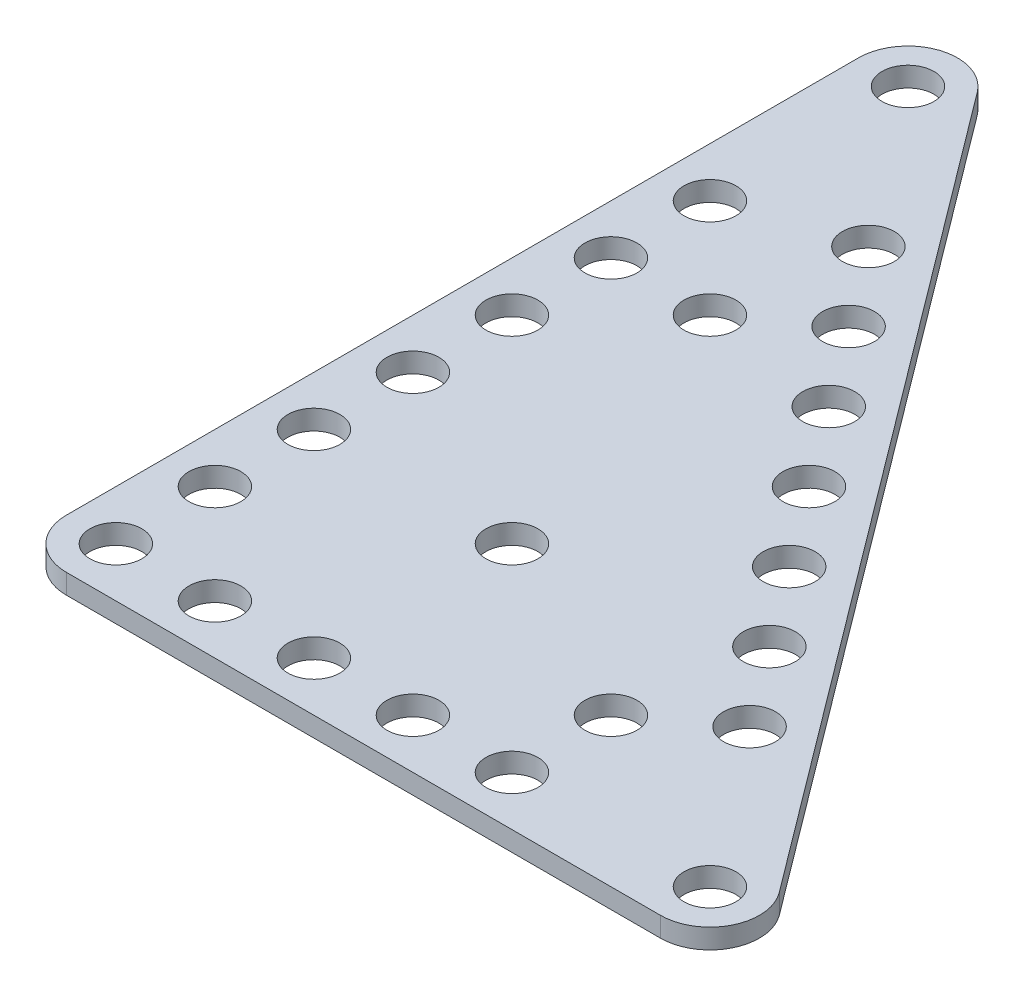
ISO-10303-21;
HEADER;
FILE_DESCRIPTION(('STEP AP214'),'2;1');
FILE_NAME('part.step','',(''),(''),'','','');
FILE_SCHEMA(('AUTOMOTIVE_DESIGN { 1 0 10303 214 1 1 1 1 }'));
ENDSEC;
DATA;
#1=APPLICATION_CONTEXT('core data for automotive mechanical design processes');
#2=APPLICATION_PROTOCOL_DEFINITION('international standard','automotive_design',2000,#1);
#3=PRODUCT_CONTEXT('',#1,'mechanical');
#4=PRODUCT('Part','Part','',(#3));
#5=PRODUCT_RELATED_PRODUCT_CATEGORY('part','',(#4));
#6=PRODUCT_DEFINITION_FORMATION('','',#4);
#7=PRODUCT_DEFINITION_CONTEXT('part definition',#1,'design');
#8=PRODUCT_DEFINITION('design','',#6,#7);
#9=PRODUCT_DEFINITION_SHAPE('','',#8);
#10=(LENGTH_UNIT() NAMED_UNIT(*) SI_UNIT(.MILLI.,.METRE.));
#11=(NAMED_UNIT(*) PLANE_ANGLE_UNIT() SI_UNIT($,.RADIAN.));
#12=(NAMED_UNIT(*) SI_UNIT($,.STERADIAN.) SOLID_ANGLE_UNIT());
#13=UNCERTAINTY_MEASURE_WITH_UNIT(LENGTH_MEASURE(1.E-05),#10,'distance_accuracy_value','');
#14=(GEOMETRIC_REPRESENTATION_CONTEXT(3) GLOBAL_UNCERTAINTY_ASSIGNED_CONTEXT((#13)) GLOBAL_UNIT_ASSIGNED_CONTEXT((#10,
#11,#12)) REPRESENTATION_CONTEXT('',''));
#15=CARTESIAN_POINT('',(0.,0.,0.));
#16=DIRECTION('',(0.,0.,1.));
#17=DIRECTION('',(1.,0.,0.));
#18=AXIS2_PLACEMENT_3D('',#15,#16,#17);
#19=CARTESIAN_POINT('',(0.,1.6,0.));
#20=DIRECTION('',(0.,1.,0.));
#21=DIRECTION('',(0.,0.,1.));
#22=AXIS2_PLACEMENT_3D('',#19,#20,#21);
#23=PLANE('',#22);
#24=DIRECTION('',(-0.6,0.,-0.8));
#25=VECTOR('',#24,1.);
#26=CARTESIAN_POINT('',(33.92,1.6,-25.44));
#27=LINE('',#26,#25);
#28=CARTESIAN_POINT('',(3.20000000000001,1.6,-66.4));
#29=VERTEX_POINT('',#28);
#30=CARTESIAN_POINT('',(51.2,1.6,-2.4));
#31=VERTEX_POINT('',#30);
#32=EDGE_CURVE('E100',#29,#31,#27,.F.);
#33=ORIENTED_EDGE('',*,*,#32,.F.);
#34=CARTESIAN_POINT('',(0.,1.6,-64.));
#35=DIRECTION('',(0.,-1.,0.));
#36=DIRECTION('',(0.,0.,-1.));
#37=AXIS2_PLACEMENT_3D('',#34,#35,#36);
#38=CIRCLE('',#37,4.);
#39=CARTESIAN_POINT('',(-4.,1.6,-64.));
#40=VERTEX_POINT('',#39);
#41=EDGE_CURVE('E179',#40,#29,#38,.T.);
#42=ORIENTED_EDGE('',*,*,#41,.F.);
#43=DIRECTION('',(0.,0.,1.));
#44=VECTOR('',#43,1.);
#45=CARTESIAN_POINT('',(-4.,1.6,0.));
#46=LINE('',#45,#44);
#47=CARTESIAN_POINT('',(-4.,1.6,0.));
#48=VERTEX_POINT('',#47);
#49=EDGE_CURVE('E75',#48,#40,#46,.F.);
#50=ORIENTED_EDGE('',*,*,#49,.F.);
#51=CARTESIAN_POINT('',(0.,1.6,0.));
#52=DIRECTION('',(0.,-1.,0.));
#53=DIRECTION('',(0.,0.,-1.));
#54=AXIS2_PLACEMENT_3D('',#51,#52,#53);
#55=CIRCLE('',#54,4.);
#56=CARTESIAN_POINT('',(0.,1.6,4.));
#57=VERTEX_POINT('',#56);
#58=EDGE_CURVE('E67',#57,#48,#55,.T.);
#59=ORIENTED_EDGE('',*,*,#58,.F.);
#60=DIRECTION('',(-1.,0.,0.));
#61=VECTOR('',#60,1.);
#62=CARTESIAN_POINT('',(0.,1.6,4.));
#63=LINE('',#62,#61);
#64=CARTESIAN_POINT('',(48.,1.6,4.));
#65=VERTEX_POINT('',#64);
#66=EDGE_CURVE('E72',#57,#65,#63,.F.);
#67=ORIENTED_EDGE('',*,*,#66,.T.);
#68=CARTESIAN_POINT('',(48.,1.6,0.));
#69=DIRECTION('',(0.,-1.,0.));
#70=DIRECTION('',(0.,0.,-1.));
#71=AXIS2_PLACEMENT_3D('',#68,#69,#70);
#72=CIRCLE('',#71,4.);
#73=EDGE_CURVE('E88',#31,#65,#72,.T.);
#74=ORIENTED_EDGE('',*,*,#73,.F.);
#75=EDGE_LOOP('',(#33,#42,#50,#59,#67,#74));
#76=FACE_BOUND('',#75,.T.);
#77=CARTESIAN_POINT('',(-1.6759110426447E-13,1.6,-48.));
#78=DIRECTION('',(0.,-1.,0.));
#79=DIRECTION('',(0.,0.,-1.));
#80=AXIS2_PLACEMENT_3D('',#77,#78,#79);
#81=CIRCLE('',#80,2.1);
#82=CARTESIAN_POINT('',(-1.6759110426447E-13,1.6,-50.1));
#83=VERTEX_POINT('',#82);
#84=EDGE_CURVE('E81',#83,#83,#81,.T.);
#85=ORIENTED_EDGE('',*,*,#84,.T.);
#86=EDGE_LOOP('',(#85));
#87=FACE_BOUND('',#86,.T.);
#88=CARTESIAN_POINT('',(-1.39659253553725E-13,1.6,-40.));
#89=DIRECTION('',(0.,-1.,0.));
#90=DIRECTION('',(0.,0.,-1.));
#91=AXIS2_PLACEMENT_3D('',#88,#89,#90);
#92=CIRCLE('',#91,2.1);
#93=CARTESIAN_POINT('',(-1.39659253553725E-13,1.6,-42.1));
#94=VERTEX_POINT('',#93);
#95=EDGE_CURVE('E185',#94,#94,#92,.T.);
#96=ORIENTED_EDGE('',*,*,#95,.T.);
#97=EDGE_LOOP('',(#96));
#98=FACE_BOUND('',#97,.T.);
#99=CARTESIAN_POINT('',(-1.1172740284298E-13,1.6,-32.));
#100=DIRECTION('',(0.,-1.,0.));
#101=DIRECTION('',(0.,0.,-1.));
#102=AXIS2_PLACEMENT_3D('',#99,#100,#101);
#103=CIRCLE('',#102,2.1);
#104=CARTESIAN_POINT('',(-1.1172740284298E-13,1.6,-34.1));
#105=VERTEX_POINT('',#104);
#106=EDGE_CURVE('E188',#105,#105,#103,.T.);
#107=ORIENTED_EDGE('',*,*,#106,.T.);
#108=EDGE_LOOP('',(#107));
#109=FACE_BOUND('',#108,.T.);
#110=CARTESIAN_POINT('',(0.,1.6,-24.));
#111=DIRECTION('',(0.,-1.,0.));
#112=DIRECTION('',(0.,0.,-1.));
#113=AXIS2_PLACEMENT_3D('',#110,#111,#112);
#114=CIRCLE('',#113,2.1);
#115=CARTESIAN_POINT('',(0.,1.6,-26.1));
#116=VERTEX_POINT('',#115);
#117=EDGE_CURVE('E191',#116,#116,#114,.T.);
#118=ORIENTED_EDGE('',*,*,#117,.T.);
#119=EDGE_LOOP('',(#118));
#120=FACE_BOUND('',#119,.T.);
#121=CARTESIAN_POINT('',(0.,1.6,-16.));
#122=DIRECTION('',(0.,-1.,0.));
#123=DIRECTION('',(0.,0.,-1.));
#124=AXIS2_PLACEMENT_3D('',#121,#122,#123);
#125=CIRCLE('',#124,2.1);
#126=CARTESIAN_POINT('',(0.,1.6,-18.1));
#127=VERTEX_POINT('',#126);
#128=EDGE_CURVE('E194',#127,#127,#125,.T.);
#129=ORIENTED_EDGE('',*,*,#128,.T.);
#130=EDGE_LOOP('',(#129));
#131=FACE_BOUND('',#130,.T.);
#132=CARTESIAN_POINT('',(0.,1.6,-8.));
#133=DIRECTION('',(0.,-1.,0.));
#134=DIRECTION('',(0.,0.,-1.));
#135=AXIS2_PLACEMENT_3D('',#132,#133,#134);
#136=CIRCLE('',#135,2.1);
#137=CARTESIAN_POINT('',(0.,1.6,-10.1));
#138=VERTEX_POINT('',#137);
#139=EDGE_CURVE('E197',#138,#138,#136,.T.);
#140=ORIENTED_EDGE('',*,*,#139,.T.);
#141=EDGE_LOOP('',(#140));
#142=FACE_BOUND('',#141,.T.);
#143=CARTESIAN_POINT('',(32.,1.6,0.));
#144=DIRECTION('',(0.,-1.,0.));
#145=DIRECTION('',(0.,0.,-1.));
#146=AXIS2_PLACEMENT_3D('',#143,#144,#145);
#147=CIRCLE('',#146,2.1);
#148=CARTESIAN_POINT('',(32.,1.6,-2.1));
#149=VERTEX_POINT('',#148);
#150=EDGE_CURVE('E200',#149,#149,#147,.T.);
#151=ORIENTED_EDGE('',*,*,#150,.T.);
#152=EDGE_LOOP('',(#151));
#153=FACE_BOUND('',#152,.T.);
#154=CARTESIAN_POINT('',(24.,1.6,0.));
#155=DIRECTION('',(0.,-1.,0.));
#156=DIRECTION('',(0.,0.,-1.));
#157=AXIS2_PLACEMENT_3D('',#154,#155,#156);
#158=CIRCLE('',#157,2.1);
#159=CARTESIAN_POINT('',(24.,1.6,-2.1));
#160=VERTEX_POINT('',#159);
#161=EDGE_CURVE('E203',#160,#160,#158,.T.);
#162=ORIENTED_EDGE('',*,*,#161,.T.);
#163=EDGE_LOOP('',(#162));
#164=FACE_BOUND('',#163,.T.);
#165=CARTESIAN_POINT('',(16.,1.6,0.));
#166=DIRECTION('',(0.,-1.,0.));
#167=DIRECTION('',(0.,0.,-1.));
#168=AXIS2_PLACEMENT_3D('',#165,#166,#167);
#169=CIRCLE('',#168,2.1);
#170=CARTESIAN_POINT('',(16.,1.6,-2.1));
#171=VERTEX_POINT('',#170);
#172=EDGE_CURVE('E206',#171,#171,#169,.T.);
#173=ORIENTED_EDGE('',*,*,#172,.T.);
#174=EDGE_LOOP('',(#173));
#175=FACE_BOUND('',#174,.T.);
#176=CARTESIAN_POINT('',(8.,1.6,0.));
#177=DIRECTION('',(0.,-1.,0.));
#178=DIRECTION('',(0.,0.,-1.));
#179=AXIS2_PLACEMENT_3D('',#176,#177,#178);
#180=CIRCLE('',#179,2.1);
#181=CARTESIAN_POINT('',(8.,1.6,-2.1));
#182=VERTEX_POINT('',#181);
#183=EDGE_CURVE('E209',#182,#182,#180,.T.);
#184=ORIENTED_EDGE('',*,*,#183,.T.);
#185=EDGE_LOOP('',(#184));
#186=FACE_BOUND('',#185,.T.);
#187=CARTESIAN_POINT('',(48.,1.6,0.));
#188=DIRECTION('',(0.,-1.,0.));
#189=DIRECTION('',(0.,0.,-1.));
#190=AXIS2_PLACEMENT_3D('',#187,#188,#189);
#191=CIRCLE('',#190,2.1);
#192=CARTESIAN_POINT('',(48.,1.6,-2.1));
#193=VERTEX_POINT('',#192);
#194=EDGE_CURVE('E212',#193,#193,#191,.T.);
#195=ORIENTED_EDGE('',*,*,#194,.T.);
#196=EDGE_LOOP('',(#195));
#197=FACE_BOUND('',#196,.T.);
#198=CARTESIAN_POINT('',(0.,1.6,0.));
#199=DIRECTION('',(0.,-1.,0.));
#200=DIRECTION('',(0.,0.,-1.));
#201=AXIS2_PLACEMENT_3D('',#198,#199,#200);
#202=CIRCLE('',#201,2.1);
#203=CARTESIAN_POINT('',(0.,1.6,-2.1));
#204=VERTEX_POINT('',#203);
#205=EDGE_CURVE('E215',#204,#204,#202,.T.);
#206=ORIENTED_EDGE('',*,*,#205,.T.);
#207=EDGE_LOOP('',(#206));
#208=FACE_BOUND('',#207,.T.);
#209=CARTESIAN_POINT('',(0.,1.6,-64.));
#210=DIRECTION('',(0.,-1.,0.));
#211=DIRECTION('',(0.,0.,-1.));
#212=AXIS2_PLACEMENT_3D('',#209,#210,#211);
#213=CIRCLE('',#212,2.1);
#214=CARTESIAN_POINT('',(0.,1.6,-66.1));
#215=VERTEX_POINT('',#214);
#216=EDGE_CURVE('E218',#215,#215,#213,.T.);
#217=ORIENTED_EDGE('',*,*,#216,.T.);
#218=EDGE_LOOP('',(#217));
#219=FACE_BOUND('',#218,.T.);
#220=CARTESIAN_POINT('',(16.,1.6,-16.));
#221=DIRECTION('',(0.,-1.,0.));
#222=DIRECTION('',(0.,0.,-1.));
#223=AXIS2_PLACEMENT_3D('',#220,#221,#222);
#224=CIRCLE('',#223,2.1);
#225=CARTESIAN_POINT('',(16.,1.6,-18.1));
#226=VERTEX_POINT('',#225);
#227=EDGE_CURVE('E221',#226,#226,#224,.T.);
#228=ORIENTED_EDGE('',*,*,#227,.T.);
#229=EDGE_LOOP('',(#228));
#230=FACE_BOUND('',#229,.T.);
#231=CARTESIAN_POINT('',(32.,1.6,-8.));
#232=DIRECTION('',(0.,-1.,0.));
#233=DIRECTION('',(0.,0.,-1.));
#234=AXIS2_PLACEMENT_3D('',#231,#232,#233);
#235=CIRCLE('',#234,2.1);
#236=CARTESIAN_POINT('',(32.,1.6,-10.1));
#237=VERTEX_POINT('',#236);
#238=EDGE_CURVE('E224',#237,#237,#235,.T.);
#239=ORIENTED_EDGE('',*,*,#238,.T.);
#240=EDGE_LOOP('',(#239));
#241=FACE_BOUND('',#240,.T.);
#242=CARTESIAN_POINT('',(8.,1.6,-40.));
#243=DIRECTION('',(0.,-1.,0.));
#244=DIRECTION('',(0.,0.,-1.));
#245=AXIS2_PLACEMENT_3D('',#242,#243,#244);
#246=CIRCLE('',#245,2.1);
#247=CARTESIAN_POINT('',(8.,1.6,-42.1));
#248=VERTEX_POINT('',#247);
#249=EDGE_CURVE('E227',#248,#248,#246,.T.);
#250=ORIENTED_EDGE('',*,*,#249,.T.);
#251=EDGE_LOOP('',(#250));
#252=FACE_BOUND('',#251,.T.);
#253=CARTESIAN_POINT('',(9.6,1.6,-51.2));
#254=DIRECTION('',(0.,-1.,0.));
#255=DIRECTION('',(0.,0.,-1.));
#256=AXIS2_PLACEMENT_3D('',#253,#254,#255);
#257=CIRCLE('',#256,2.1);
#258=CARTESIAN_POINT('',(9.6,1.6,-53.3));
#259=VERTEX_POINT('',#258);
#260=EDGE_CURVE('E230',#259,#259,#257,.T.);
#261=ORIENTED_EDGE('',*,*,#260,.T.);
#262=EDGE_LOOP('',(#261));
#263=FACE_BOUND('',#262,.T.);
#264=CARTESIAN_POINT('',(14.4,1.6,-44.8));
#265=DIRECTION('',(0.,-1.,0.));
#266=DIRECTION('',(0.,0.,-1.));
#267=AXIS2_PLACEMENT_3D('',#264,#265,#266);
#268=CIRCLE('',#267,2.1);
#269=CARTESIAN_POINT('',(14.4,1.6,-46.9));
#270=VERTEX_POINT('',#269);
#271=EDGE_CURVE('E233',#270,#270,#268,.T.);
#272=ORIENTED_EDGE('',*,*,#271,.T.);
#273=EDGE_LOOP('',(#272));
#274=FACE_BOUND('',#273,.T.);
#275=CARTESIAN_POINT('',(19.2,1.6,-38.4));
#276=DIRECTION('',(0.,-1.,0.));
#277=DIRECTION('',(0.,0.,-1.));
#278=AXIS2_PLACEMENT_3D('',#275,#276,#277);
#279=CIRCLE('',#278,2.1);
#280=CARTESIAN_POINT('',(19.2,1.6,-40.5));
#281=VERTEX_POINT('',#280);
#282=EDGE_CURVE('E236',#281,#281,#279,.T.);
#283=ORIENTED_EDGE('',*,*,#282,.T.);
#284=EDGE_LOOP('',(#283));
#285=FACE_BOUND('',#284,.T.);
#286=CARTESIAN_POINT('',(24.,1.6,-32.));
#287=DIRECTION('',(0.,-1.,0.));
#288=DIRECTION('',(0.,0.,-1.));
#289=AXIS2_PLACEMENT_3D('',#286,#287,#288);
#290=CIRCLE('',#289,2.1);
#291=CARTESIAN_POINT('',(24.,1.6,-34.1));
#292=VERTEX_POINT('',#291);
#293=EDGE_CURVE('E239',#292,#292,#290,.T.);
#294=ORIENTED_EDGE('',*,*,#293,.T.);
#295=EDGE_LOOP('',(#294));
#296=FACE_BOUND('',#295,.T.);
#297=CARTESIAN_POINT('',(28.8,1.6,-25.6));
#298=DIRECTION('',(0.,-1.,0.));
#299=DIRECTION('',(0.,0.,-1.));
#300=AXIS2_PLACEMENT_3D('',#297,#298,#299);
#301=CIRCLE('',#300,2.1);
#302=CARTESIAN_POINT('',(28.8,1.6,-27.7));
#303=VERTEX_POINT('',#302);
#304=EDGE_CURVE('E242',#303,#303,#301,.T.);
#305=ORIENTED_EDGE('',*,*,#304,.T.);
#306=EDGE_LOOP('',(#305));
#307=FACE_BOUND('',#306,.T.);
#308=CARTESIAN_POINT('',(33.6,1.6,-19.2));
#309=DIRECTION('',(0.,-1.,0.));
#310=DIRECTION('',(0.,0.,-1.));
#311=AXIS2_PLACEMENT_3D('',#308,#309,#310);
#312=CIRCLE('',#311,2.1);
#313=CARTESIAN_POINT('',(33.6,1.6,-21.3));
#314=VERTEX_POINT('',#313);
#315=EDGE_CURVE('E244',#314,#314,#312,.T.);
#316=ORIENTED_EDGE('',*,*,#315,.T.);
#317=EDGE_LOOP('',(#316));
#318=FACE_BOUND('',#317,.T.);
#319=CARTESIAN_POINT('',(38.4,1.6,-12.8));
#320=DIRECTION('',(0.,-1.,0.));
#321=DIRECTION('',(0.,0.,-1.));
#322=AXIS2_PLACEMENT_3D('',#319,#320,#321);
#323=CIRCLE('',#322,2.1);
#324=CARTESIAN_POINT('',(38.4,1.6,-14.9));
#325=VERTEX_POINT('',#324);
#326=EDGE_CURVE('E20',#325,#325,#323,.T.);
#327=ORIENTED_EDGE('',*,*,#326,.T.);
#328=EDGE_LOOP('',(#327));
#329=FACE_BOUND('',#328,.T.);
#330=ADVANCED_FACE('F17',(#76,#87,#98,#109,#120,#131,#142,#153,#164,#175,#186,#197,#208,#219,
#230,#241,#252,#263,#274,#285,#296,#307,#318,#329),#23,.T.);
#331=CARTESIAN_POINT('',(38.4,1.6,-12.8));
#332=DIRECTION('',(0.,-1.,0.));
#333=DIRECTION('',(0.,0.,-1.));
#334=AXIS2_PLACEMENT_3D('',#331,#332,#333);
#335=CYLINDRICAL_SURFACE('',#334,2.1);
#336=CARTESIAN_POINT('',(38.4,0.,-12.8));
#337=DIRECTION('',(0.,-1.,0.));
#338=DIRECTION('',(0.,0.,-1.));
#339=AXIS2_PLACEMENT_3D('',#336,#337,#338);
#340=CIRCLE('',#339,2.1);
#341=CARTESIAN_POINT('',(38.4,0.,-14.9));
#342=VERTEX_POINT('',#341);
#343=EDGE_CURVE('E176',#342,#342,#340,.T.);
#344=ORIENTED_EDGE('',*,*,#343,.T.);
#345=EDGE_LOOP('',(#344));
#346=FACE_BOUND('',#345,.T.);
#347=ORIENTED_EDGE('',*,*,#326,.F.);
#348=EDGE_LOOP('',(#347));
#349=FACE_BOUND('',#348,.T.);
#350=ADVANCED_FACE('F252',(#346,#349),#335,.F.);
#351=CARTESIAN_POINT('',(33.6,1.6,-19.2));
#352=DIRECTION('',(0.,-1.,0.));
#353=DIRECTION('',(0.,0.,-1.));
#354=AXIS2_PLACEMENT_3D('',#351,#352,#353);
#355=CYLINDRICAL_SURFACE('',#354,2.1);
#356=CARTESIAN_POINT('',(33.6,0.,-19.2));
#357=DIRECTION('',(0.,-1.,0.));
#358=DIRECTION('',(0.,0.,-1.));
#359=AXIS2_PLACEMENT_3D('',#356,#357,#358);
#360=CIRCLE('',#359,2.1);
#361=CARTESIAN_POINT('',(33.6,0.,-21.3));
#362=VERTEX_POINT('',#361);
#363=EDGE_CURVE('E173',#362,#362,#360,.T.);
#364=ORIENTED_EDGE('',*,*,#363,.T.);
#365=EDGE_LOOP('',(#364));
#366=FACE_BOUND('',#365,.T.);
#367=ORIENTED_EDGE('',*,*,#315,.F.);
#368=EDGE_LOOP('',(#367));
#369=FACE_BOUND('',#368,.T.);
#370=ADVANCED_FACE('F254',(#366,#369),#355,.F.);
#371=CARTESIAN_POINT('',(28.8,1.6,-25.6));
#372=DIRECTION('',(0.,-1.,0.));
#373=DIRECTION('',(0.,0.,-1.));
#374=AXIS2_PLACEMENT_3D('',#371,#372,#373);
#375=CYLINDRICAL_SURFACE('',#374,2.1);
#376=CARTESIAN_POINT('',(28.8,0.,-25.6));
#377=DIRECTION('',(0.,-1.,0.));
#378=DIRECTION('',(0.,0.,-1.));
#379=AXIS2_PLACEMENT_3D('',#376,#377,#378);
#380=CIRCLE('',#379,2.1);
#381=CARTESIAN_POINT('',(28.8,0.,-27.7));
#382=VERTEX_POINT('',#381);
#383=EDGE_CURVE('E170',#382,#382,#380,.T.);
#384=ORIENTED_EDGE('',*,*,#383,.T.);
#385=EDGE_LOOP('',(#384));
#386=FACE_BOUND('',#385,.T.);
#387=ORIENTED_EDGE('',*,*,#304,.F.);
#388=EDGE_LOOP('',(#387));
#389=FACE_BOUND('',#388,.T.);
#390=ADVANCED_FACE('F261',(#386,#389),#375,.F.);
#391=CARTESIAN_POINT('',(24.,1.6,-32.));
#392=DIRECTION('',(0.,-1.,0.));
#393=DIRECTION('',(0.,0.,-1.));
#394=AXIS2_PLACEMENT_3D('',#391,#392,#393);
#395=CYLINDRICAL_SURFACE('',#394,2.1);
#396=CARTESIAN_POINT('',(24.,0.,-32.));
#397=DIRECTION('',(0.,-1.,0.));
#398=DIRECTION('',(0.,0.,-1.));
#399=AXIS2_PLACEMENT_3D('',#396,#397,#398);
#400=CIRCLE('',#399,2.1);
#401=CARTESIAN_POINT('',(24.,0.,-34.1));
#402=VERTEX_POINT('',#401);
#403=EDGE_CURVE('E167',#402,#402,#400,.T.);
#404=ORIENTED_EDGE('',*,*,#403,.T.);
#405=EDGE_LOOP('',(#404));
#406=FACE_BOUND('',#405,.T.);
#407=ORIENTED_EDGE('',*,*,#293,.F.);
#408=EDGE_LOOP('',(#407));
#409=FACE_BOUND('',#408,.T.);
#410=ADVANCED_FACE('F367',(#406,#409),#395,.F.);
#411=CARTESIAN_POINT('',(19.2,1.6,-38.4));
#412=DIRECTION('',(0.,-1.,0.));
#413=DIRECTION('',(0.,0.,-1.));
#414=AXIS2_PLACEMENT_3D('',#411,#412,#413);
#415=CYLINDRICAL_SURFACE('',#414,2.1);
#416=CARTESIAN_POINT('',(19.2,0.,-38.4));
#417=DIRECTION('',(0.,-1.,0.));
#418=DIRECTION('',(0.,0.,-1.));
#419=AXIS2_PLACEMENT_3D('',#416,#417,#418);
#420=CIRCLE('',#419,2.1);
#421=CARTESIAN_POINT('',(19.2,0.,-40.5));
#422=VERTEX_POINT('',#421);
#423=EDGE_CURVE('E164',#422,#422,#420,.T.);
#424=ORIENTED_EDGE('',*,*,#423,.T.);
#425=EDGE_LOOP('',(#424));
#426=FACE_BOUND('',#425,.T.);
#427=ORIENTED_EDGE('',*,*,#282,.F.);
#428=EDGE_LOOP('',(#427));
#429=FACE_BOUND('',#428,.T.);
#430=ADVANCED_FACE('F363',(#426,#429),#415,.F.);
#431=CARTESIAN_POINT('',(14.4,1.6,-44.8));
#432=DIRECTION('',(0.,-1.,0.));
#433=DIRECTION('',(0.,0.,-1.));
#434=AXIS2_PLACEMENT_3D('',#431,#432,#433);
#435=CYLINDRICAL_SURFACE('',#434,2.1);
#436=CARTESIAN_POINT('',(14.4,0.,-44.8));
#437=DIRECTION('',(0.,-1.,0.));
#438=DIRECTION('',(0.,0.,-1.));
#439=AXIS2_PLACEMENT_3D('',#436,#437,#438);
#440=CIRCLE('',#439,2.1);
#441=CARTESIAN_POINT('',(14.4,0.,-46.9));
#442=VERTEX_POINT('',#441);
#443=EDGE_CURVE('E161',#442,#442,#440,.T.);
#444=ORIENTED_EDGE('',*,*,#443,.T.);
#445=EDGE_LOOP('',(#444));
#446=FACE_BOUND('',#445,.T.);
#447=ORIENTED_EDGE('',*,*,#271,.F.);
#448=EDGE_LOOP('',(#447));
#449=FACE_BOUND('',#448,.T.);
#450=ADVANCED_FACE('F359',(#446,#449),#435,.F.);
#451=CARTESIAN_POINT('',(9.6,1.6,-51.2));
#452=DIRECTION('',(0.,-1.,0.));
#453=DIRECTION('',(0.,0.,-1.));
#454=AXIS2_PLACEMENT_3D('',#451,#452,#453);
#455=CYLINDRICAL_SURFACE('',#454,2.1);
#456=CARTESIAN_POINT('',(9.6,0.,-51.2));
#457=DIRECTION('',(0.,-1.,0.));
#458=DIRECTION('',(0.,0.,-1.));
#459=AXIS2_PLACEMENT_3D('',#456,#457,#458);
#460=CIRCLE('',#459,2.1);
#461=CARTESIAN_POINT('',(9.6,0.,-53.3));
#462=VERTEX_POINT('',#461);
#463=EDGE_CURVE('E158',#462,#462,#460,.T.);
#464=ORIENTED_EDGE('',*,*,#463,.T.);
#465=EDGE_LOOP('',(#464));
#466=FACE_BOUND('',#465,.T.);
#467=ORIENTED_EDGE('',*,*,#260,.F.);
#468=EDGE_LOOP('',(#467));
#469=FACE_BOUND('',#468,.T.);
#470=ADVANCED_FACE('F355',(#466,#469),#455,.F.);
#471=CARTESIAN_POINT('',(8.,1.6,-40.));
#472=DIRECTION('',(0.,-1.,0.));
#473=DIRECTION('',(0.,0.,-1.));
#474=AXIS2_PLACEMENT_3D('',#471,#472,#473);
#475=CYLINDRICAL_SURFACE('',#474,2.1);
#476=CARTESIAN_POINT('',(8.,0.,-40.));
#477=DIRECTION('',(0.,-1.,0.));
#478=DIRECTION('',(0.,0.,-1.));
#479=AXIS2_PLACEMENT_3D('',#476,#477,#478);
#480=CIRCLE('',#479,2.1);
#481=CARTESIAN_POINT('',(8.,0.,-42.1));
#482=VERTEX_POINT('',#481);
#483=EDGE_CURVE('E155',#482,#482,#480,.T.);
#484=ORIENTED_EDGE('',*,*,#483,.T.);
#485=EDGE_LOOP('',(#484));
#486=FACE_BOUND('',#485,.T.);
#487=ORIENTED_EDGE('',*,*,#249,.F.);
#488=EDGE_LOOP('',(#487));
#489=FACE_BOUND('',#488,.T.);
#490=ADVANCED_FACE('F351',(#486,#489),#475,.F.);
#491=CARTESIAN_POINT('',(32.,1.6,-8.));
#492=DIRECTION('',(0.,-1.,0.));
#493=DIRECTION('',(0.,0.,-1.));
#494=AXIS2_PLACEMENT_3D('',#491,#492,#493);
#495=CYLINDRICAL_SURFACE('',#494,2.1);
#496=CARTESIAN_POINT('',(32.,0.,-8.));
#497=DIRECTION('',(0.,-1.,0.));
#498=DIRECTION('',(0.,0.,-1.));
#499=AXIS2_PLACEMENT_3D('',#496,#497,#498);
#500=CIRCLE('',#499,2.1);
#501=CARTESIAN_POINT('',(32.,0.,-10.1));
#502=VERTEX_POINT('',#501);
#503=EDGE_CURVE('E152',#502,#502,#500,.T.);
#504=ORIENTED_EDGE('',*,*,#503,.T.);
#505=EDGE_LOOP('',(#504));
#506=FACE_BOUND('',#505,.T.);
#507=ORIENTED_EDGE('',*,*,#238,.F.);
#508=EDGE_LOOP('',(#507));
#509=FACE_BOUND('',#508,.T.);
#510=ADVANCED_FACE('F347',(#506,#509),#495,.F.);
#511=CARTESIAN_POINT('',(16.,1.6,-16.));
#512=DIRECTION('',(0.,-1.,0.));
#513=DIRECTION('',(0.,0.,-1.));
#514=AXIS2_PLACEMENT_3D('',#511,#512,#513);
#515=CYLINDRICAL_SURFACE('',#514,2.1);
#516=CARTESIAN_POINT('',(16.,0.,-16.));
#517=DIRECTION('',(0.,-1.,0.));
#518=DIRECTION('',(0.,0.,-1.));
#519=AXIS2_PLACEMENT_3D('',#516,#517,#518);
#520=CIRCLE('',#519,2.1);
#521=CARTESIAN_POINT('',(16.,0.,-18.1));
#522=VERTEX_POINT('',#521);
#523=EDGE_CURVE('E149',#522,#522,#520,.T.);
#524=ORIENTED_EDGE('',*,*,#523,.T.);
#525=EDGE_LOOP('',(#524));
#526=FACE_BOUND('',#525,.T.);
#527=ORIENTED_EDGE('',*,*,#227,.F.);
#528=EDGE_LOOP('',(#527));
#529=FACE_BOUND('',#528,.T.);
#530=ADVANCED_FACE('F343',(#526,#529),#515,.F.);
#531=CARTESIAN_POINT('',(0.,1.6,-64.));
#532=DIRECTION('',(0.,-1.,0.));
#533=DIRECTION('',(0.,0.,-1.));
#534=AXIS2_PLACEMENT_3D('',#531,#532,#533);
#535=CYLINDRICAL_SURFACE('',#534,2.1);
#536=CARTESIAN_POINT('',(0.,0.,-64.));
#537=DIRECTION('',(0.,-1.,0.));
#538=DIRECTION('',(0.,0.,-1.));
#539=AXIS2_PLACEMENT_3D('',#536,#537,#538);
#540=CIRCLE('',#539,2.1);
#541=CARTESIAN_POINT('',(0.,0.,-66.1));
#542=VERTEX_POINT('',#541);
#543=EDGE_CURVE('E146',#542,#542,#540,.T.);
#544=ORIENTED_EDGE('',*,*,#543,.T.);
#545=EDGE_LOOP('',(#544));
#546=FACE_BOUND('',#545,.T.);
#547=ORIENTED_EDGE('',*,*,#216,.F.);
#548=EDGE_LOOP('',(#547));
#549=FACE_BOUND('',#548,.T.);
#550=ADVANCED_FACE('F339',(#546,#549),#535,.F.);
#551=CARTESIAN_POINT('',(0.,1.6,0.));
#552=DIRECTION('',(0.,-1.,0.));
#553=DIRECTION('',(0.,0.,-1.));
#554=AXIS2_PLACEMENT_3D('',#551,#552,#553);
#555=CYLINDRICAL_SURFACE('',#554,2.1);
#556=CARTESIAN_POINT('',(0.,0.,0.));
#557=DIRECTION('',(0.,-1.,0.));
#558=DIRECTION('',(0.,0.,-1.));
#559=AXIS2_PLACEMENT_3D('',#556,#557,#558);
#560=CIRCLE('',#559,2.1);
#561=CARTESIAN_POINT('',(0.,0.,-2.1));
#562=VERTEX_POINT('',#561);
#563=EDGE_CURVE('E143',#562,#562,#560,.T.);
#564=ORIENTED_EDGE('',*,*,#563,.T.);
#565=EDGE_LOOP('',(#564));
#566=FACE_BOUND('',#565,.T.);
#567=ORIENTED_EDGE('',*,*,#205,.F.);
#568=EDGE_LOOP('',(#567));
#569=FACE_BOUND('',#568,.T.);
#570=ADVANCED_FACE('F335',(#566,#569),#555,.F.);
#571=CARTESIAN_POINT('',(48.,1.6,0.));
#572=DIRECTION('',(0.,-1.,0.));
#573=DIRECTION('',(0.,0.,-1.));
#574=AXIS2_PLACEMENT_3D('',#571,#572,#573);
#575=CYLINDRICAL_SURFACE('',#574,2.1);
#576=CARTESIAN_POINT('',(48.,0.,0.));
#577=DIRECTION('',(0.,-1.,0.));
#578=DIRECTION('',(0.,0.,-1.));
#579=AXIS2_PLACEMENT_3D('',#576,#577,#578);
#580=CIRCLE('',#579,2.1);
#581=CARTESIAN_POINT('',(48.,0.,-2.1));
#582=VERTEX_POINT('',#581);
#583=EDGE_CURVE('E140',#582,#582,#580,.T.);
#584=ORIENTED_EDGE('',*,*,#583,.T.);
#585=EDGE_LOOP('',(#584));
#586=FACE_BOUND('',#585,.T.);
#587=ORIENTED_EDGE('',*,*,#194,.F.);
#588=EDGE_LOOP('',(#587));
#589=FACE_BOUND('',#588,.T.);
#590=ADVANCED_FACE('F331',(#586,#589),#575,.F.);
#591=CARTESIAN_POINT('',(8.,1.6,0.));
#592=DIRECTION('',(0.,-1.,0.));
#593=DIRECTION('',(0.,0.,-1.));
#594=AXIS2_PLACEMENT_3D('',#591,#592,#593);
#595=CYLINDRICAL_SURFACE('',#594,2.1);
#596=CARTESIAN_POINT('',(8.,0.,0.));
#597=DIRECTION('',(0.,-1.,0.));
#598=DIRECTION('',(0.,0.,-1.));
#599=AXIS2_PLACEMENT_3D('',#596,#597,#598);
#600=CIRCLE('',#599,2.1);
#601=CARTESIAN_POINT('',(8.,0.,-2.1));
#602=VERTEX_POINT('',#601);
#603=EDGE_CURVE('E137',#602,#602,#600,.T.);
#604=ORIENTED_EDGE('',*,*,#603,.T.);
#605=EDGE_LOOP('',(#604));
#606=FACE_BOUND('',#605,.T.);
#607=ORIENTED_EDGE('',*,*,#183,.F.);
#608=EDGE_LOOP('',(#607));
#609=FACE_BOUND('',#608,.T.);
#610=ADVANCED_FACE('F327',(#606,#609),#595,.F.);
#611=CARTESIAN_POINT('',(16.,1.6,0.));
#612=DIRECTION('',(0.,-1.,0.));
#613=DIRECTION('',(0.,0.,-1.));
#614=AXIS2_PLACEMENT_3D('',#611,#612,#613);
#615=CYLINDRICAL_SURFACE('',#614,2.1);
#616=CARTESIAN_POINT('',(16.,0.,0.));
#617=DIRECTION('',(0.,-1.,0.));
#618=DIRECTION('',(0.,0.,-1.));
#619=AXIS2_PLACEMENT_3D('',#616,#617,#618);
#620=CIRCLE('',#619,2.1);
#621=CARTESIAN_POINT('',(16.,0.,-2.1));
#622=VERTEX_POINT('',#621);
#623=EDGE_CURVE('E134',#622,#622,#620,.T.);
#624=ORIENTED_EDGE('',*,*,#623,.T.);
#625=EDGE_LOOP('',(#624));
#626=FACE_BOUND('',#625,.T.);
#627=ORIENTED_EDGE('',*,*,#172,.F.);
#628=EDGE_LOOP('',(#627));
#629=FACE_BOUND('',#628,.T.);
#630=ADVANCED_FACE('F323',(#626,#629),#615,.F.);
#631=CARTESIAN_POINT('',(24.,1.6,0.));
#632=DIRECTION('',(0.,-1.,0.));
#633=DIRECTION('',(0.,0.,-1.));
#634=AXIS2_PLACEMENT_3D('',#631,#632,#633);
#635=CYLINDRICAL_SURFACE('',#634,2.1);
#636=CARTESIAN_POINT('',(24.,0.,0.));
#637=DIRECTION('',(0.,-1.,0.));
#638=DIRECTION('',(0.,0.,-1.));
#639=AXIS2_PLACEMENT_3D('',#636,#637,#638);
#640=CIRCLE('',#639,2.1);
#641=CARTESIAN_POINT('',(24.,0.,-2.1));
#642=VERTEX_POINT('',#641);
#643=EDGE_CURVE('E131',#642,#642,#640,.T.);
#644=ORIENTED_EDGE('',*,*,#643,.T.);
#645=EDGE_LOOP('',(#644));
#646=FACE_BOUND('',#645,.T.);
#647=ORIENTED_EDGE('',*,*,#161,.F.);
#648=EDGE_LOOP('',(#647));
#649=FACE_BOUND('',#648,.T.);
#650=ADVANCED_FACE('F319',(#646,#649),#635,.F.);
#651=CARTESIAN_POINT('',(32.,1.6,0.));
#652=DIRECTION('',(0.,-1.,0.));
#653=DIRECTION('',(0.,0.,-1.));
#654=AXIS2_PLACEMENT_3D('',#651,#652,#653);
#655=CYLINDRICAL_SURFACE('',#654,2.1);
#656=CARTESIAN_POINT('',(32.,0.,0.));
#657=DIRECTION('',(0.,-1.,0.));
#658=DIRECTION('',(0.,0.,-1.));
#659=AXIS2_PLACEMENT_3D('',#656,#657,#658);
#660=CIRCLE('',#659,2.1);
#661=CARTESIAN_POINT('',(32.,0.,-2.1));
#662=VERTEX_POINT('',#661);
#663=EDGE_CURVE('E128',#662,#662,#660,.T.);
#664=ORIENTED_EDGE('',*,*,#663,.T.);
#665=EDGE_LOOP('',(#664));
#666=FACE_BOUND('',#665,.T.);
#667=ORIENTED_EDGE('',*,*,#150,.F.);
#668=EDGE_LOOP('',(#667));
#669=FACE_BOUND('',#668,.T.);
#670=ADVANCED_FACE('F315',(#666,#669),#655,.F.);
#671=CARTESIAN_POINT('',(0.,1.6,-8.));
#672=DIRECTION('',(0.,-1.,0.));
#673=DIRECTION('',(0.,0.,-1.));
#674=AXIS2_PLACEMENT_3D('',#671,#672,#673);
#675=CYLINDRICAL_SURFACE('',#674,2.1);
#676=CARTESIAN_POINT('',(0.,0.,-8.));
#677=DIRECTION('',(0.,-1.,0.));
#678=DIRECTION('',(0.,0.,-1.));
#679=AXIS2_PLACEMENT_3D('',#676,#677,#678);
#680=CIRCLE('',#679,2.1);
#681=CARTESIAN_POINT('',(0.,0.,-10.1));
#682=VERTEX_POINT('',#681);
#683=EDGE_CURVE('E125',#682,#682,#680,.T.);
#684=ORIENTED_EDGE('',*,*,#683,.T.);
#685=EDGE_LOOP('',(#684));
#686=FACE_BOUND('',#685,.T.);
#687=ORIENTED_EDGE('',*,*,#139,.F.);
#688=EDGE_LOOP('',(#687));
#689=FACE_BOUND('',#688,.T.);
#690=ADVANCED_FACE('F311',(#686,#689),#675,.F.);
#691=CARTESIAN_POINT('',(0.,1.6,-16.));
#692=DIRECTION('',(0.,-1.,0.));
#693=DIRECTION('',(0.,0.,-1.));
#694=AXIS2_PLACEMENT_3D('',#691,#692,#693);
#695=CYLINDRICAL_SURFACE('',#694,2.1);
#696=CARTESIAN_POINT('',(0.,0.,-16.));
#697=DIRECTION('',(0.,-1.,0.));
#698=DIRECTION('',(0.,0.,-1.));
#699=AXIS2_PLACEMENT_3D('',#696,#697,#698);
#700=CIRCLE('',#699,2.1);
#701=CARTESIAN_POINT('',(0.,0.,-18.1));
#702=VERTEX_POINT('',#701);
#703=EDGE_CURVE('E122',#702,#702,#700,.T.);
#704=ORIENTED_EDGE('',*,*,#703,.T.);
#705=EDGE_LOOP('',(#704));
#706=FACE_BOUND('',#705,.T.);
#707=ORIENTED_EDGE('',*,*,#128,.F.);
#708=EDGE_LOOP('',(#707));
#709=FACE_BOUND('',#708,.T.);
#710=ADVANCED_FACE('F307',(#706,#709),#695,.F.);
#711=CARTESIAN_POINT('',(0.,1.6,-24.));
#712=DIRECTION('',(0.,-1.,0.));
#713=DIRECTION('',(0.,0.,-1.));
#714=AXIS2_PLACEMENT_3D('',#711,#712,#713);
#715=CYLINDRICAL_SURFACE('',#714,2.1);
#716=CARTESIAN_POINT('',(0.,0.,-24.));
#717=DIRECTION('',(0.,-1.,0.));
#718=DIRECTION('',(0.,0.,-1.));
#719=AXIS2_PLACEMENT_3D('',#716,#717,#718);
#720=CIRCLE('',#719,2.1);
#721=CARTESIAN_POINT('',(0.,0.,-26.1));
#722=VERTEX_POINT('',#721);
#723=EDGE_CURVE('E119',#722,#722,#720,.T.);
#724=ORIENTED_EDGE('',*,*,#723,.T.);
#725=EDGE_LOOP('',(#724));
#726=FACE_BOUND('',#725,.T.);
#727=ORIENTED_EDGE('',*,*,#117,.F.);
#728=EDGE_LOOP('',(#727));
#729=FACE_BOUND('',#728,.T.);
#730=ADVANCED_FACE('F303',(#726,#729),#715,.F.);
#731=CARTESIAN_POINT('',(-1.1172740284298E-13,1.6,-32.));
#732=DIRECTION('',(0.,-1.,0.));
#733=DIRECTION('',(0.,0.,-1.));
#734=AXIS2_PLACEMENT_3D('',#731,#732,#733);
#735=CYLINDRICAL_SURFACE('',#734,2.1);
#736=CARTESIAN_POINT('',(-1.1172740284298E-13,0.,-32.));
#737=DIRECTION('',(0.,-1.,0.));
#738=DIRECTION('',(0.,0.,-1.));
#739=AXIS2_PLACEMENT_3D('',#736,#737,#738);
#740=CIRCLE('',#739,2.1);
#741=CARTESIAN_POINT('',(-1.1172740284298E-13,0.,-34.1));
#742=VERTEX_POINT('',#741);
#743=EDGE_CURVE('E116',#742,#742,#740,.T.);
#744=ORIENTED_EDGE('',*,*,#743,.T.);
#745=EDGE_LOOP('',(#744));
#746=FACE_BOUND('',#745,.T.);
#747=ORIENTED_EDGE('',*,*,#106,.F.);
#748=EDGE_LOOP('',(#747));
#749=FACE_BOUND('',#748,.T.);
#750=ADVANCED_FACE('F299',(#746,#749),#735,.F.);
#751=CARTESIAN_POINT('',(-1.39659253553725E-13,1.6,-40.));
#752=DIRECTION('',(0.,-1.,0.));
#753=DIRECTION('',(0.,0.,-1.));
#754=AXIS2_PLACEMENT_3D('',#751,#752,#753);
#755=CYLINDRICAL_SURFACE('',#754,2.1);
#756=CARTESIAN_POINT('',(-1.39659253553725E-13,0.,-40.));
#757=DIRECTION('',(0.,-1.,0.));
#758=DIRECTION('',(0.,0.,-1.));
#759=AXIS2_PLACEMENT_3D('',#756,#757,#758);
#760=CIRCLE('',#759,2.1);
#761=CARTESIAN_POINT('',(-1.39659253553725E-13,0.,-42.1));
#762=VERTEX_POINT('',#761);
#763=EDGE_CURVE('E113',#762,#762,#760,.T.);
#764=ORIENTED_EDGE('',*,*,#763,.T.);
#765=EDGE_LOOP('',(#764));
#766=FACE_BOUND('',#765,.T.);
#767=ORIENTED_EDGE('',*,*,#95,.F.);
#768=EDGE_LOOP('',(#767));
#769=FACE_BOUND('',#768,.T.);
#770=ADVANCED_FACE('F295',(#766,#769),#755,.F.);
#771=CARTESIAN_POINT('',(-1.6759110426447E-13,1.6,-48.));
#772=DIRECTION('',(0.,-1.,0.));
#773=DIRECTION('',(0.,0.,-1.));
#774=AXIS2_PLACEMENT_3D('',#771,#772,#773);
#775=CYLINDRICAL_SURFACE('',#774,2.1);
#776=CARTESIAN_POINT('',(-1.6759110426447E-13,0.,-48.));
#777=DIRECTION('',(0.,-1.,0.));
#778=DIRECTION('',(0.,0.,-1.));
#779=AXIS2_PLACEMENT_3D('',#776,#777,#778);
#780=CIRCLE('',#779,2.1);
#781=CARTESIAN_POINT('',(-1.6759110426447E-13,0.,-50.1));
#782=VERTEX_POINT('',#781);
#783=EDGE_CURVE('E110',#782,#782,#780,.T.);
#784=ORIENTED_EDGE('',*,*,#783,.T.);
#785=EDGE_LOOP('',(#784));
#786=FACE_BOUND('',#785,.T.);
#787=ORIENTED_EDGE('',*,*,#84,.F.);
#788=EDGE_LOOP('',(#787));
#789=FACE_BOUND('',#788,.T.);
#790=ADVANCED_FACE('F292',(#786,#789),#775,.F.);
#791=CARTESIAN_POINT('',(0.,1.6,0.));
#792=DIRECTION('',(0.,-1.,0.));
#793=DIRECTION('',(0.,0.,-1.));
#794=AXIS2_PLACEMENT_3D('',#791,#792,#793);
#795=CYLINDRICAL_SURFACE('',#794,4.);
#796=ORIENTED_EDGE('',*,*,#58,.T.);
#797=DIRECTION('',(0.,1.,0.));
#798=VECTOR('',#797,1.);
#799=CARTESIAN_POINT('',(-4.,1.6,0.));
#800=LINE('',#799,#798);
#801=CARTESIAN_POINT('',(-4.,0.,0.));
#802=VERTEX_POINT('',#801);
#803=EDGE_CURVE('E99',#802,#48,#800,.T.);
#804=ORIENTED_EDGE('',*,*,#803,.F.);
#805=CARTESIAN_POINT('',(0.,0.,0.));
#806=DIRECTION('',(0.,-1.,0.));
#807=DIRECTION('',(0.,0.,-1.));
#808=AXIS2_PLACEMENT_3D('',#805,#806,#807);
#809=CIRCLE('',#808,4.);
#810=CARTESIAN_POINT('',(0.,0.,4.));
#811=VERTEX_POINT('',#810);
#812=EDGE_CURVE('E92',#802,#811,#809,.F.);
#813=ORIENTED_EDGE('',*,*,#812,.T.);
#814=DIRECTION('',(0.,1.,0.));
#815=VECTOR('',#814,1.);
#816=CARTESIAN_POINT('',(0.,1.6,4.));
#817=LINE('',#816,#815);
#818=EDGE_CURVE('E80',#811,#57,#817,.T.);
#819=ORIENTED_EDGE('',*,*,#818,.T.);
#820=EDGE_LOOP('',(#796,#804,#813,#819));
#821=FACE_BOUND('',#820,.T.);
#822=ADVANCED_FACE('F91',(#821),#795,.T.);
#823=CARTESIAN_POINT('',(0.,1.6,4.));
#824=DIRECTION('',(0.,0.,-1.));
#825=DIRECTION('',(-1.,0.,0.));
#826=AXIS2_PLACEMENT_3D('',#823,#824,#825);
#827=PLANE('',#826);
#828=DIRECTION('',(0.,-1.,0.));
#829=VECTOR('',#828,1.);
#830=CARTESIAN_POINT('',(48.,1.6,4.));
#831=LINE('',#830,#829);
#832=CARTESIAN_POINT('',(48.,0.,4.));
#833=VERTEX_POINT('',#832);
#834=EDGE_CURVE('E87',#65,#833,#831,.T.);
#835=ORIENTED_EDGE('',*,*,#834,.F.);
#836=ORIENTED_EDGE('',*,*,#66,.F.);
#837=ORIENTED_EDGE('',*,*,#818,.F.);
#838=DIRECTION('',(1.,0.,0.));
#839=VECTOR('',#838,1.);
#840=CARTESIAN_POINT('',(0.,0.,4.));
#841=LINE('',#840,#839);
#842=EDGE_CURVE('E108',#811,#833,#841,.T.);
#843=ORIENTED_EDGE('',*,*,#842,.T.);
#844=EDGE_LOOP('',(#835,#836,#837,#843));
#845=FACE_BOUND('',#844,.T.);
#846=ADVANCED_FACE('F84',(#845),#827,.F.);
#847=CARTESIAN_POINT('',(48.,1.6,0.));
#848=DIRECTION('',(0.,-1.,0.));
#849=DIRECTION('',(0.,0.,-1.));
#850=AXIS2_PLACEMENT_3D('',#847,#848,#849);
#851=CYLINDRICAL_SURFACE('',#850,4.);
#852=ORIENTED_EDGE('',*,*,#73,.T.);
#853=ORIENTED_EDGE('',*,*,#834,.T.);
#854=CARTESIAN_POINT('',(48.,0.,0.));
#855=DIRECTION('',(0.,-1.,0.));
#856=DIRECTION('',(0.,0.,-1.));
#857=AXIS2_PLACEMENT_3D('',#854,#855,#856);
#858=CIRCLE('',#857,4.);
#859=CARTESIAN_POINT('',(51.2,0.,-2.4));
#860=VERTEX_POINT('',#859);
#861=EDGE_CURVE('E105',#833,#860,#858,.F.);
#862=ORIENTED_EDGE('',*,*,#861,.T.);
#863=DIRECTION('',(0.,1.,0.));
#864=VECTOR('',#863,1.);
#865=CARTESIAN_POINT('',(51.2,1.6,-2.4));
#866=LINE('',#865,#864);
#867=EDGE_CURVE('E101',#31,#860,#866,.F.);
#868=ORIENTED_EDGE('',*,*,#867,.F.);
#869=EDGE_LOOP('',(#852,#853,#862,#868));
#870=FACE_BOUND('',#869,.T.);
#871=ADVANCED_FACE('F283',(#870),#851,.T.);
#872=CARTESIAN_POINT('',(33.92,1.6,-25.44));
#873=DIRECTION('',(0.8,0.,-0.6));
#874=DIRECTION('',(-0.6,0.,-0.8));
#875=AXIS2_PLACEMENT_3D('',#872,#873,#874);
#876=PLANE('',#875);
#877=ORIENTED_EDGE('',*,*,#32,.T.);
#878=ORIENTED_EDGE('',*,*,#867,.T.);
#879=DIRECTION('',(-0.6,0.,-0.8));
#880=VECTOR('',#879,1.);
#881=CARTESIAN_POINT('',(51.2,0.,-2.4));
#882=LINE('',#881,#880);
#883=CARTESIAN_POINT('',(3.2,0.,-66.4));
#884=VERTEX_POINT('',#883);
#885=EDGE_CURVE('E104',#860,#884,#882,.T.);
#886=ORIENTED_EDGE('',*,*,#885,.T.);
#887=DIRECTION('',(0.,-1.,0.));
#888=VECTOR('',#887,1.);
#889=CARTESIAN_POINT('',(3.2,1.6,-66.4));
#890=LINE('',#889,#888);
#891=EDGE_CURVE('E181',#29,#884,#890,.T.);
#892=ORIENTED_EDGE('',*,*,#891,.F.);
#893=EDGE_LOOP('',(#877,#878,#886,#892));
#894=FACE_BOUND('',#893,.T.);
#895=ADVANCED_FACE('F280',(#894),#876,.T.);
#896=CARTESIAN_POINT('',(0.,1.6,-64.));
#897=DIRECTION('',(0.,-1.,0.));
#898=DIRECTION('',(0.,0.,-1.));
#899=AXIS2_PLACEMENT_3D('',#896,#897,#898);
#900=CYLINDRICAL_SURFACE('',#899,4.);
#901=CARTESIAN_POINT('',(0.,0.,-64.));
#902=DIRECTION('',(0.,-1.,0.));
#903=DIRECTION('',(0.,0.,-1.));
#904=AXIS2_PLACEMENT_3D('',#901,#902,#903);
#905=CIRCLE('',#904,4.);
#906=CARTESIAN_POINT('',(-4.,0.,-64.));
#907=VERTEX_POINT('',#906);
#908=EDGE_CURVE('E26',#884,#907,#905,.F.);
#909=ORIENTED_EDGE('',*,*,#908,.T.);
#910=DIRECTION('',(0.,1.,0.));
#911=VECTOR('',#910,1.);
#912=CARTESIAN_POINT('',(-4.,1.6,-64.));
#913=LINE('',#912,#911);
#914=EDGE_CURVE('E98',#40,#907,#913,.F.);
#915=ORIENTED_EDGE('',*,*,#914,.F.);
#916=ORIENTED_EDGE('',*,*,#41,.T.);
#917=ORIENTED_EDGE('',*,*,#891,.T.);
#918=EDGE_LOOP('',(#909,#915,#916,#917));
#919=FACE_BOUND('',#918,.T.);
#920=ADVANCED_FACE('F272',(#919),#900,.T.);
#921=CARTESIAN_POINT('',(-4.,1.6,0.));
#922=DIRECTION('',(-1.,0.,0.));
#923=DIRECTION('',(0.,0.,1.));
#924=AXIS2_PLACEMENT_3D('',#921,#922,#923);
#925=PLANE('',#924);
#926=ORIENTED_EDGE('',*,*,#49,.T.);
#927=ORIENTED_EDGE('',*,*,#914,.T.);
#928=DIRECTION('',(0.,0.,1.));
#929=VECTOR('',#928,1.);
#930=CARTESIAN_POINT('',(-4.,0.,0.));
#931=LINE('',#930,#929);
#932=EDGE_CURVE('E10',#907,#802,#931,.T.);
#933=ORIENTED_EDGE('',*,*,#932,.T.);
#934=ORIENTED_EDGE('',*,*,#803,.T.);
#935=EDGE_LOOP('',(#926,#927,#933,#934));
#936=FACE_BOUND('',#935,.T.);
#937=ADVANCED_FACE('F266',(#936),#925,.T.);
#938=CARTESIAN_POINT('',(0.,0.,0.));
#939=DIRECTION('',(0.,1.,0.));
#940=DIRECTION('',(0.,0.,1.));
#941=AXIS2_PLACEMENT_3D('',#938,#939,#940);
#942=PLANE('',#941);
#943=ORIENTED_EDGE('',*,*,#932,.F.);
#944=ORIENTED_EDGE('',*,*,#908,.F.);
#945=ORIENTED_EDGE('',*,*,#885,.F.);
#946=ORIENTED_EDGE('',*,*,#861,.F.);
#947=ORIENTED_EDGE('',*,*,#842,.F.);
#948=ORIENTED_EDGE('',*,*,#812,.F.);
#949=EDGE_LOOP('',(#943,#944,#945,#946,#947,#948));
#950=FACE_BOUND('',#949,.T.);
#951=ORIENTED_EDGE('',*,*,#783,.F.);
#952=EDGE_LOOP('',(#951));
#953=FACE_BOUND('',#952,.T.);
#954=ORIENTED_EDGE('',*,*,#763,.F.);
#955=EDGE_LOOP('',(#954));
#956=FACE_BOUND('',#955,.T.);
#957=ORIENTED_EDGE('',*,*,#743,.F.);
#958=EDGE_LOOP('',(#957));
#959=FACE_BOUND('',#958,.T.);
#960=ORIENTED_EDGE('',*,*,#723,.F.);
#961=EDGE_LOOP('',(#960));
#962=FACE_BOUND('',#961,.T.);
#963=ORIENTED_EDGE('',*,*,#703,.F.);
#964=EDGE_LOOP('',(#963));
#965=FACE_BOUND('',#964,.T.);
#966=ORIENTED_EDGE('',*,*,#683,.F.);
#967=EDGE_LOOP('',(#966));
#968=FACE_BOUND('',#967,.T.);
#969=ORIENTED_EDGE('',*,*,#663,.F.);
#970=EDGE_LOOP('',(#969));
#971=FACE_BOUND('',#970,.T.);
#972=ORIENTED_EDGE('',*,*,#643,.F.);
#973=EDGE_LOOP('',(#972));
#974=FACE_BOUND('',#973,.T.);
#975=ORIENTED_EDGE('',*,*,#623,.F.);
#976=EDGE_LOOP('',(#975));
#977=FACE_BOUND('',#976,.T.);
#978=ORIENTED_EDGE('',*,*,#603,.F.);
#979=EDGE_LOOP('',(#978));
#980=FACE_BOUND('',#979,.T.);
#981=ORIENTED_EDGE('',*,*,#583,.F.);
#982=EDGE_LOOP('',(#981));
#983=FACE_BOUND('',#982,.T.);
#984=ORIENTED_EDGE('',*,*,#563,.F.);
#985=EDGE_LOOP('',(#984));
#986=FACE_BOUND('',#985,.T.);
#987=ORIENTED_EDGE('',*,*,#543,.F.);
#988=EDGE_LOOP('',(#987));
#989=FACE_BOUND('',#988,.T.);
#990=ORIENTED_EDGE('',*,*,#523,.F.);
#991=EDGE_LOOP('',(#990));
#992=FACE_BOUND('',#991,.T.);
#993=ORIENTED_EDGE('',*,*,#503,.F.);
#994=EDGE_LOOP('',(#993));
#995=FACE_BOUND('',#994,.T.);
#996=ORIENTED_EDGE('',*,*,#483,.F.);
#997=EDGE_LOOP('',(#996));
#998=FACE_BOUND('',#997,.T.);
#999=ORIENTED_EDGE('',*,*,#463,.F.);
#1000=EDGE_LOOP('',(#999));
#1001=FACE_BOUND('',#1000,.T.);
#1002=ORIENTED_EDGE('',*,*,#443,.F.);
#1003=EDGE_LOOP('',(#1002));
#1004=FACE_BOUND('',#1003,.T.);
#1005=ORIENTED_EDGE('',*,*,#423,.F.);
#1006=EDGE_LOOP('',(#1005));
#1007=FACE_BOUND('',#1006,.T.);
#1008=ORIENTED_EDGE('',*,*,#403,.F.);
#1009=EDGE_LOOP('',(#1008));
#1010=FACE_BOUND('',#1009,.T.);
#1011=ORIENTED_EDGE('',*,*,#383,.F.);
#1012=EDGE_LOOP('',(#1011));
#1013=FACE_BOUND('',#1012,.T.);
#1014=ORIENTED_EDGE('',*,*,#363,.F.);
#1015=EDGE_LOOP('',(#1014));
#1016=FACE_BOUND('',#1015,.T.);
#1017=ORIENTED_EDGE('',*,*,#343,.F.);
#1018=EDGE_LOOP('',(#1017));
#1019=FACE_BOUND('',#1018,.T.);
#1020=ADVANCED_FACE('F264',(#950,#953,#956,#959,#962,#965,#968,#971,#974,#977,#980,#983,#986,
#989,#992,#995,#998,#1001,#1004,#1007,#1010,#1013,#1016,#1019),#942,.F.);
#1021=CLOSED_SHELL('',(#330,#350,#370,#390,#410,#430,#450,#470,#490,#510,#530,#550,#570,#590,
#610,#630,#650,#670,#690,#710,#730,#750,#770,#790,#822,#846,#871,#895,#920,#937,#1020));
#1022=MANIFOLD_SOLID_BREP('B1',#1021);
#1023=ADVANCED_BREP_SHAPE_REPRESENTATION('',(#18,#1022),#14);
#1024=SHAPE_DEFINITION_REPRESENTATION(#9,#1023);
ENDSEC;
END-ISO-10303-21;
